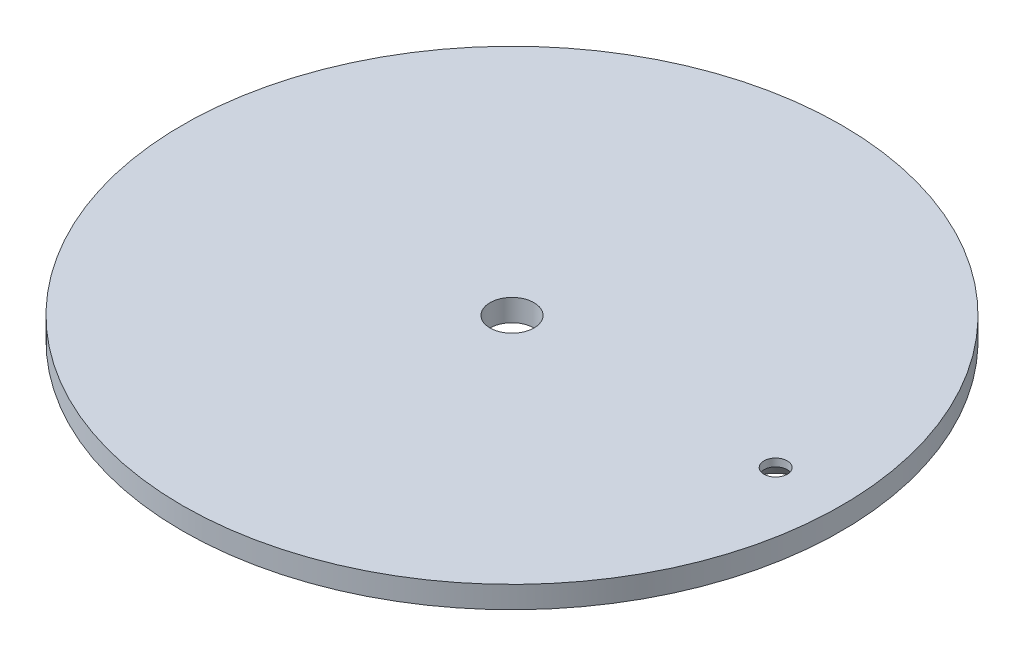
ISO-10303-21;
HEADER;
FILE_DESCRIPTION(('STEP AP214'),'2;1');
FILE_NAME('part.step','',(''),(''),'','','');
FILE_SCHEMA(('AUTOMOTIVE_DESIGN { 1 0 10303 214 1 1 1 1 }'));
ENDSEC;
DATA;
#1=APPLICATION_CONTEXT('core data for automotive mechanical design processes');
#2=APPLICATION_PROTOCOL_DEFINITION('international standard','automotive_design',2000,#1);
#3=PRODUCT_CONTEXT('',#1,'mechanical');
#4=PRODUCT('Part','Part','',(#3));
#5=PRODUCT_RELATED_PRODUCT_CATEGORY('part','',(#4));
#6=PRODUCT_DEFINITION_FORMATION('','',#4);
#7=PRODUCT_DEFINITION_CONTEXT('part definition',#1,'design');
#8=PRODUCT_DEFINITION('design','',#6,#7);
#9=PRODUCT_DEFINITION_SHAPE('','',#8);
#10=(LENGTH_UNIT() NAMED_UNIT(*) SI_UNIT(.MILLI.,.METRE.));
#11=(NAMED_UNIT(*) PLANE_ANGLE_UNIT() SI_UNIT($,.RADIAN.));
#12=(NAMED_UNIT(*) SI_UNIT($,.STERADIAN.) SOLID_ANGLE_UNIT());
#13=UNCERTAINTY_MEASURE_WITH_UNIT(LENGTH_MEASURE(1.E-05),#10,'distance_accuracy_value','');
#14=(GEOMETRIC_REPRESENTATION_CONTEXT(3) GLOBAL_UNCERTAINTY_ASSIGNED_CONTEXT((#13)) GLOBAL_UNIT_ASSIGNED_CONTEXT((#10,
#11,#12)) REPRESENTATION_CONTEXT('',''));
#15=CARTESIAN_POINT('',(0.,0.,0.));
#16=DIRECTION('',(0.,0.,1.));
#17=DIRECTION('',(1.,0.,0.));
#18=AXIS2_PLACEMENT_3D('',#15,#16,#17);
#19=CARTESIAN_POINT('',(0.,0.,0.));
#20=DIRECTION('',(0.,1.,0.));
#21=DIRECTION('',(0.,0.,1.));
#22=AXIS2_PLACEMENT_3D('',#19,#20,#21);
#23=PLANE('',#22);
#24=CARTESIAN_POINT('',(76.2,5.6843418860808E-11,0.));
#25=DIRECTION('',(0.,-1.,0.));
#26=DIRECTION('',(0.,0.,-1.));
#27=AXIS2_PLACEMENT_3D('',#24,#25,#26);
#28=CIRCLE('',#27,6.95960000005061);
#29=CARTESIAN_POINT('',(76.2,5.6843418860808E-11,-6.95960000005061));
#30=VERTEX_POINT('',#29);
#31=EDGE_CURVE('E17',#30,#30,#28,.F.);
#32=ORIENTED_EDGE('',*,*,#31,.T.);
#33=EDGE_LOOP('',(#32));
#34=FACE_BOUND('',#33,.T.);
#35=CARTESIAN_POINT('',(0.,0.,0.));
#36=DIRECTION('',(0.,1.,0.));
#37=DIRECTION('',(0.,0.,1.));
#38=AXIS2_PLACEMENT_3D('',#35,#36,#37);
#39=CIRCLE('',#38,6.35);
#40=CARTESIAN_POINT('',(0.,0.,6.35));
#41=VERTEX_POINT('',#40);
#42=EDGE_CURVE('E33',#41,#41,#39,.T.);
#43=ORIENTED_EDGE('',*,*,#42,.T.);
#44=EDGE_LOOP('',(#43));
#45=FACE_BOUND('',#44,.T.);
#46=CARTESIAN_POINT('',(0.,0.,0.));
#47=DIRECTION('',(0.,1.,0.));
#48=DIRECTION('',(0.,0.,1.));
#49=AXIS2_PLACEMENT_3D('',#46,#47,#48);
#50=CIRCLE('',#49,95.25);
#51=CARTESIAN_POINT('',(0.,0.,95.25));
#52=VERTEX_POINT('',#51);
#53=EDGE_CURVE('E35',#52,#52,#50,.T.);
#54=ORIENTED_EDGE('',*,*,#53,.F.);
#55=EDGE_LOOP('',(#54));
#56=FACE_BOUND('',#55,.T.);
#57=ADVANCED_FACE('F14',(#34,#45,#56),#23,.F.);
#58=CARTESIAN_POINT('',(76.2,2.27373675443232E-10,0.));
#59=DIRECTION('',(0.,-1.,0.));
#60=DIRECTION('',(0.,0.,-1.));
#61=AXIS2_PLACEMENT_3D('',#58,#59,#60);
#62=CONICAL_SURFACE('',#61,6.95959999990237,0.715584993319846);
#63=CARTESIAN_POINT('',(76.2,4.13453909239372,0.));
#64=DIRECTION('',(0.,-1.,0.));
#65=DIRECTION('',(0.,0.,-1.));
#66=AXIS2_PLACEMENT_3D('',#63,#64,#65);
#67=CIRCLE('',#66,3.3655);
#68=CARTESIAN_POINT('',(76.2,4.13453909239372,-3.3655));
#69=VERTEX_POINT('',#68);
#70=EDGE_CURVE('E29',#69,#69,#67,.F.);
#71=ORIENTED_EDGE('',*,*,#70,.T.);
#72=EDGE_LOOP('',(#71));
#73=FACE_BOUND('',#72,.T.);
#74=ORIENTED_EDGE('',*,*,#31,.F.);
#75=EDGE_LOOP('',(#74));
#76=FACE_BOUND('',#75,.T.);
#77=ADVANCED_FACE('F44',(#73,#76),#62,.F.);
#78=CARTESIAN_POINT('',(0.,0.,0.));
#79=DIRECTION('',(0.,1.,0.));
#80=DIRECTION('',(0.,0.,1.));
#81=AXIS2_PLACEMENT_3D('',#78,#79,#80);
#82=CYLINDRICAL_SURFACE('',#81,95.25);
#83=CARTESIAN_POINT('',(0.,6.35,0.));
#84=DIRECTION('',(0.,1.,0.));
#85=DIRECTION('',(0.,0.,1.));
#86=AXIS2_PLACEMENT_3D('',#83,#84,#85);
#87=CIRCLE('',#86,95.25);
#88=CARTESIAN_POINT('',(0.,6.35,95.25));
#89=VERTEX_POINT('',#88);
#90=EDGE_CURVE('E26',#89,#89,#87,.T.);
#91=ORIENTED_EDGE('',*,*,#90,.F.);
#92=EDGE_LOOP('',(#91));
#93=FACE_BOUND('',#92,.T.);
#94=ORIENTED_EDGE('',*,*,#53,.T.);
#95=EDGE_LOOP('',(#94));
#96=FACE_BOUND('',#95,.T.);
#97=ADVANCED_FACE('F46',(#93,#96),#82,.T.);
#98=CARTESIAN_POINT('',(0.,0.,0.));
#99=DIRECTION('',(0.,1.,0.));
#100=DIRECTION('',(0.,0.,1.));
#101=AXIS2_PLACEMENT_3D('',#98,#99,#100);
#102=CYLINDRICAL_SURFACE('',#101,6.35);
#103=CARTESIAN_POINT('',(0.,6.35,0.));
#104=DIRECTION('',(0.,1.,0.));
#105=DIRECTION('',(0.,0.,1.));
#106=AXIS2_PLACEMENT_3D('',#103,#104,#105);
#107=CIRCLE('',#106,6.35);
#108=CARTESIAN_POINT('',(0.,6.35,6.35));
#109=VERTEX_POINT('',#108);
#110=EDGE_CURVE('E21',#109,#109,#107,.F.);
#111=ORIENTED_EDGE('',*,*,#110,.F.);
#112=EDGE_LOOP('',(#111));
#113=FACE_BOUND('',#112,.T.);
#114=ORIENTED_EDGE('',*,*,#42,.F.);
#115=EDGE_LOOP('',(#114));
#116=FACE_BOUND('',#115,.T.);
#117=ADVANCED_FACE('F53',(#113,#116),#102,.F.);
#118=CARTESIAN_POINT('',(76.2,0.,0.));
#119=DIRECTION('',(0.,-1.,0.));
#120=DIRECTION('',(0.,0.,-1.));
#121=AXIS2_PLACEMENT_3D('',#118,#119,#120);
#122=CYLINDRICAL_SURFACE('',#121,3.3655);
#123=CARTESIAN_POINT('',(76.2,6.35,0.));
#124=DIRECTION('',(0.,-1.,0.));
#125=DIRECTION('',(0.,0.,-1.));
#126=AXIS2_PLACEMENT_3D('',#123,#124,#125);
#127=CIRCLE('',#126,3.3655);
#128=CARTESIAN_POINT('',(76.2,6.35,-3.3655));
#129=VERTEX_POINT('',#128);
#130=EDGE_CURVE('E10',#129,#129,#127,.T.);
#131=ORIENTED_EDGE('',*,*,#130,.F.);
#132=EDGE_LOOP('',(#131));
#133=FACE_BOUND('',#132,.T.);
#134=ORIENTED_EDGE('',*,*,#70,.F.);
#135=EDGE_LOOP('',(#134));
#136=FACE_BOUND('',#135,.T.);
#137=ADVANCED_FACE('F59',(#133,#136),#122,.F.);
#138=CARTESIAN_POINT('',(0.,6.35,0.));
#139=DIRECTION('',(0.,1.,0.));
#140=DIRECTION('',(0.,0.,1.));
#141=AXIS2_PLACEMENT_3D('',#138,#139,#140);
#142=PLANE('',#141);
#143=ORIENTED_EDGE('',*,*,#130,.T.);
#144=EDGE_LOOP('',(#143));
#145=FACE_BOUND('',#144,.T.);
#146=ORIENTED_EDGE('',*,*,#110,.T.);
#147=EDGE_LOOP('',(#146));
#148=FACE_BOUND('',#147,.T.);
#149=ORIENTED_EDGE('',*,*,#90,.T.);
#150=EDGE_LOOP('',(#149));
#151=FACE_BOUND('',#150,.T.);
#152=ADVANCED_FACE('F57',(#145,#148,#151),#142,.T.);
#153=CLOSED_SHELL('',(#57,#77,#97,#117,#137,#152));
#154=MANIFOLD_SOLID_BREP('B1',#153);
#155=ADVANCED_BREP_SHAPE_REPRESENTATION('',(#18,#154),#14);
#156=SHAPE_DEFINITION_REPRESENTATION(#9,#155);
ENDSEC;
END-ISO-10303-21;
